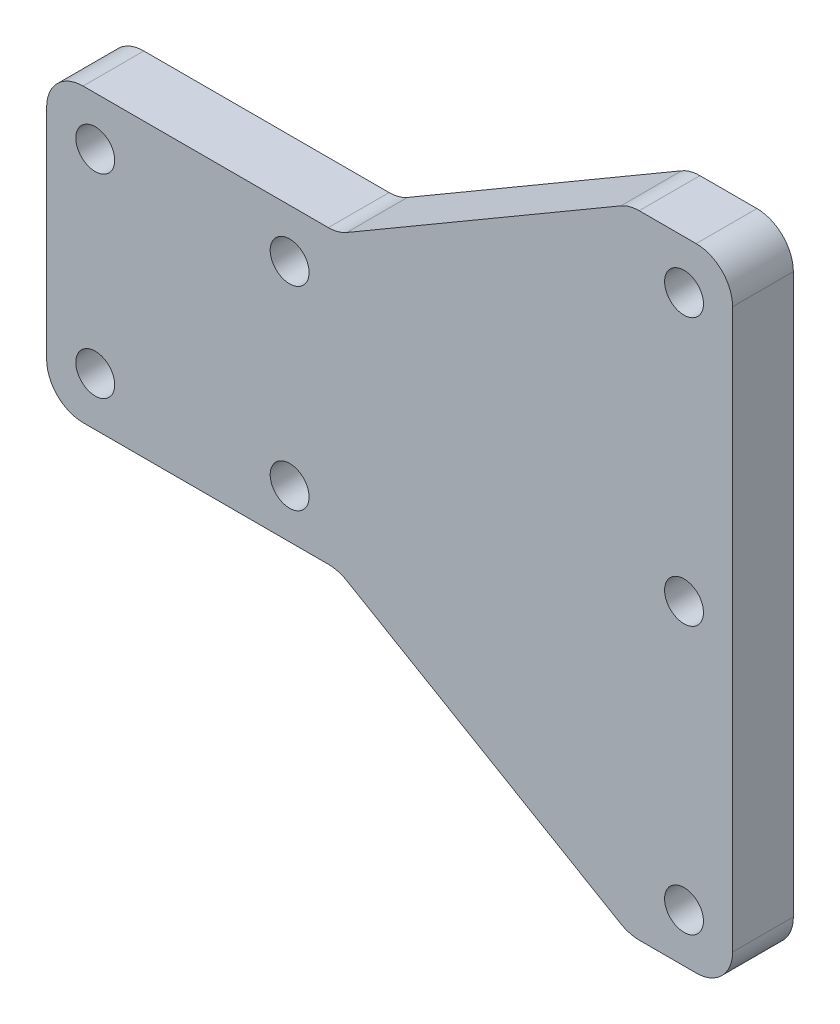
ISO-10303-21;
HEADER;
FILE_DESCRIPTION(('STEP AP214'),'2;1');
FILE_NAME('part.step','',(''),(''),'','','');
FILE_SCHEMA(('AUTOMOTIVE_DESIGN { 1 0 10303 214 1 1 1 1 }'));
ENDSEC;
DATA;
#1=APPLICATION_CONTEXT('core data for automotive mechanical design processes');
#2=APPLICATION_PROTOCOL_DEFINITION('international standard','automotive_design',2000,#1);
#3=PRODUCT_CONTEXT('',#1,'mechanical');
#4=PRODUCT('Part','Part','',(#3));
#5=PRODUCT_RELATED_PRODUCT_CATEGORY('part','',(#4));
#6=PRODUCT_DEFINITION_FORMATION('','',#4);
#7=PRODUCT_DEFINITION_CONTEXT('part definition',#1,'design');
#8=PRODUCT_DEFINITION('design','',#6,#7);
#9=PRODUCT_DEFINITION_SHAPE('','',#8);
#10=(LENGTH_UNIT() NAMED_UNIT(*) SI_UNIT(.MILLI.,.METRE.));
#11=(NAMED_UNIT(*) PLANE_ANGLE_UNIT() SI_UNIT($,.RADIAN.));
#12=(NAMED_UNIT(*) SI_UNIT($,.STERADIAN.) SOLID_ANGLE_UNIT());
#13=UNCERTAINTY_MEASURE_WITH_UNIT(LENGTH_MEASURE(1.E-05),#10,'distance_accuracy_value','');
#14=(GEOMETRIC_REPRESENTATION_CONTEXT(3) GLOBAL_UNCERTAINTY_ASSIGNED_CONTEXT((#13)) GLOBAL_UNIT_ASSIGNED_CONTEXT((#10,
#11,#12)) REPRESENTATION_CONTEXT('',''));
#15=CARTESIAN_POINT('',(0.,0.,0.));
#16=DIRECTION('',(0.,0.,1.));
#17=DIRECTION('',(1.,0.,0.));
#18=AXIS2_PLACEMENT_3D('',#15,#16,#17);
#19=CARTESIAN_POINT('',(0.,-12.,5.));
#20=DIRECTION('',(0.,1.,0.));
#21=DIRECTION('',(0.,0.,1.));
#22=AXIS2_PLACEMENT_3D('',#19,#20,#21);
#23=PLANE('',#22);
#24=DIRECTION('',(1.,0.,0.));
#25=VECTOR('',#24,1.);
#26=CARTESIAN_POINT('',(0.,-12.,0.));
#27=LINE('',#26,#25);
#28=CARTESIAN_POINT('',(-9.,-12.,0.));
#29=VERTEX_POINT('',#28);
#30=CARTESIAN_POINT('',(11.1879150973778,-12.,0.));
#31=VERTEX_POINT('',#30);
#32=EDGE_CURVE('E305',#29,#31,#27,.T.);
#33=ORIENTED_EDGE('',*,*,#32,.T.);
#34=DIRECTION('',(0.,0.,-1.));
#35=VECTOR('',#34,1.);
#36=CARTESIAN_POINT('',(11.1879150973778,-12.,5.));
#37=LINE('',#36,#35);
#38=CARTESIAN_POINT('',(11.1879150973778,-12.,5.));
#39=VERTEX_POINT('',#38);
#40=EDGE_CURVE('E293',#31,#39,#37,.F.);
#41=ORIENTED_EDGE('',*,*,#40,.T.);
#42=DIRECTION('',(1.,0.,0.));
#43=VECTOR('',#42,1.);
#44=CARTESIAN_POINT('',(0.,-12.,5.));
#45=LINE('',#44,#43);
#46=CARTESIAN_POINT('',(-9.,-12.,5.));
#47=VERTEX_POINT('',#46);
#48=EDGE_CURVE('E327',#47,#39,#45,.T.);
#49=ORIENTED_EDGE('',*,*,#48,.F.);
#50=DIRECTION('',(0.,0.,-1.));
#51=VECTOR('',#50,1.);
#52=CARTESIAN_POINT('',(-9.,-12.,5.));
#53=LINE('',#52,#51);
#54=EDGE_CURVE('E289',#47,#29,#53,.T.);
#55=ORIENTED_EDGE('',*,*,#54,.T.);
#56=EDGE_LOOP('',(#33,#41,#49,#55));
#57=FACE_BOUND('',#56,.T.);
#58=ADVANCED_FACE('F41',(#57),#23,.F.);
#59=CARTESIAN_POINT('',(-2.17323377367622,-3.72003296496675,5.));
#60=DIRECTION('',(0.504427615444684,0.863453983010554,0.));
#61=DIRECTION('',(-0.863453983010554,0.504427615444684,0.));
#62=AXIS2_PLACEMENT_3D('',#59,#60,#61);
#63=PLANE('',#62);
#64=DIRECTION('',(0.863453983010554,-0.504427615444684,0.));
#65=VECTOR('',#64,1.);
#66=CARTESIAN_POINT('',(-2.17323377367622,-3.72003296496675,0.));
#67=LINE('',#66,#65);
#68=CARTESIAN_POINT('',(12.7011979437119,-12.4096380509683,0.));
#69=VERTEX_POINT('',#68);
#70=CARTESIAN_POINT('',(35.2633023969191,-25.5903619490317,0.));
#71=VERTEX_POINT('',#70);
#72=EDGE_CURVE('E307',#69,#71,#67,.T.);
#73=ORIENTED_EDGE('',*,*,#72,.T.);
#74=DIRECTION('',(0.,0.,-1.));
#75=VECTOR('',#74,1.);
#76=CARTESIAN_POINT('',(35.263302396919,-25.5903619490317,5.));
#77=LINE('',#76,#75);
#78=CARTESIAN_POINT('',(35.2633023969191,-25.5903619490317,5.));
#79=VERTEX_POINT('',#78);
#80=EDGE_CURVE('E266',#71,#79,#77,.F.);
#81=ORIENTED_EDGE('',*,*,#80,.T.);
#82=DIRECTION('',(0.863453983010554,-0.504427615444684,0.));
#83=VECTOR('',#82,1.);
#84=CARTESIAN_POINT('',(-2.17323377367622,-3.72003296496675,5.));
#85=LINE('',#84,#83);
#86=CARTESIAN_POINT('',(12.7011979437119,-12.4096380509683,5.));
#87=VERTEX_POINT('',#86);
#88=EDGE_CURVE('E325',#87,#79,#85,.T.);
#89=ORIENTED_EDGE('',*,*,#88,.F.);
#90=DIRECTION('',(0.,0.,-1.));
#91=VECTOR('',#90,1.);
#92=CARTESIAN_POINT('',(12.7011979437119,-12.4096380509683,0.));
#93=LINE('',#92,#91);
#94=EDGE_CURVE('E262',#87,#69,#93,.T.);
#95=ORIENTED_EDGE('',*,*,#94,.T.);
#96=EDGE_LOOP('',(#73,#81,#89,#95));
#97=FACE_BOUND('',#96,.T.);
#98=ADVANCED_FACE('F329',(#97),#63,.F.);
#99=CARTESIAN_POINT('',(0.,-26.,5.));
#100=DIRECTION('',(0.,-1.,0.));
#101=DIRECTION('',(0.,0.,-1.));
#102=AXIS2_PLACEMENT_3D('',#99,#100,#101);
#103=PLANE('',#102);
#104=DIRECTION('',(-1.,0.,0.));
#105=VECTOR('',#104,1.);
#106=CARTESIAN_POINT('',(0.,-26.,0.));
#107=LINE('',#106,#105);
#108=CARTESIAN_POINT('',(41.4645003406306,-26.,0.));
#109=VERTEX_POINT('',#108);
#110=CARTESIAN_POINT('',(36.7765852432531,-26.,0.));
#111=VERTEX_POINT('',#110);
#112=EDGE_CURVE('E195',#109,#111,#107,.T.);
#113=ORIENTED_EDGE('',*,*,#112,.F.);
#114=DIRECTION('',(0.,0.,-1.));
#115=VECTOR('',#114,1.);
#116=CARTESIAN_POINT('',(41.4645003406306,-26.,5.));
#117=LINE('',#116,#115);
#118=CARTESIAN_POINT('',(41.4645003406306,-26.,5.));
#119=VERTEX_POINT('',#118);
#120=EDGE_CURVE('E259',#109,#119,#117,.F.);
#121=ORIENTED_EDGE('',*,*,#120,.T.);
#122=DIRECTION('',(-1.,0.,0.));
#123=VECTOR('',#122,1.);
#124=CARTESIAN_POINT('',(0.,-26.,5.));
#125=LINE('',#124,#123);
#126=CARTESIAN_POINT('',(36.7765852432531,-26.,5.));
#127=VERTEX_POINT('',#126);
#128=EDGE_CURVE('E332',#119,#127,#125,.T.);
#129=ORIENTED_EDGE('',*,*,#128,.T.);
#130=DIRECTION('',(0.,0.,-1.));
#131=VECTOR('',#130,1.);
#132=CARTESIAN_POINT('',(36.7765852432531,-26.,0.));
#133=LINE('',#132,#131);
#134=EDGE_CURVE('E255',#127,#111,#133,.T.);
#135=ORIENTED_EDGE('',*,*,#134,.T.);
#136=EDGE_LOOP('',(#113,#121,#129,#135));
#137=FACE_BOUND('',#136,.T.);
#138=ADVANCED_FACE('F390',(#137),#103,.T.);
#139=CARTESIAN_POINT('',(44.4645003406306,0.,5.));
#140=DIRECTION('',(1.,0.,0.));
#141=DIRECTION('',(0.,0.,-1.));
#142=AXIS2_PLACEMENT_3D('',#139,#140,#141);
#143=PLANE('',#142);
#144=DIRECTION('',(0.,-1.,0.));
#145=VECTOR('',#144,1.);
#146=CARTESIAN_POINT('',(44.4645003406306,0.,0.));
#147=LINE('',#146,#145);
#148=CARTESIAN_POINT('',(44.4645003406306,23.,0.));
#149=VERTEX_POINT('',#148);
#150=CARTESIAN_POINT('',(44.4645003406306,-23.,0.));
#151=VERTEX_POINT('',#150);
#152=EDGE_CURVE('E188',#149,#151,#147,.T.);
#153=ORIENTED_EDGE('',*,*,#152,.F.);
#154=DIRECTION('',(0.,0.,-1.));
#155=VECTOR('',#154,1.);
#156=CARTESIAN_POINT('',(44.4645003406306,23.,5.));
#157=LINE('',#156,#155);
#158=CARTESIAN_POINT('',(44.4645003406306,23.,5.));
#159=VERTEX_POINT('',#158);
#160=EDGE_CURVE('E161',#149,#159,#157,.F.);
#161=ORIENTED_EDGE('',*,*,#160,.T.);
#162=DIRECTION('',(0.,-1.,0.));
#163=VECTOR('',#162,1.);
#164=CARTESIAN_POINT('',(44.4645003406306,0.,5.));
#165=LINE('',#164,#163);
#166=CARTESIAN_POINT('',(44.4645003406306,-23.,5.));
#167=VERTEX_POINT('',#166);
#168=EDGE_CURVE('E337',#159,#167,#165,.T.);
#169=ORIENTED_EDGE('',*,*,#168,.T.);
#170=DIRECTION('',(0.,0.,-1.));
#171=VECTOR('',#170,1.);
#172=CARTESIAN_POINT('',(44.4645003406306,-23.,5.));
#173=LINE('',#172,#171);
#174=EDGE_CURVE('E167',#167,#151,#173,.T.);
#175=ORIENTED_EDGE('',*,*,#174,.T.);
#176=EDGE_LOOP('',(#153,#161,#169,#175));
#177=FACE_BOUND('',#176,.T.);
#178=ADVANCED_FACE('F398',(#177),#143,.T.);
#179=CARTESIAN_POINT('',(0.,26.,5.));
#180=DIRECTION('',(0.,-1.,0.));
#181=DIRECTION('',(0.,0.,-1.));
#182=AXIS2_PLACEMENT_3D('',#179,#180,#181);
#183=PLANE('',#182);
#184=DIRECTION('',(-1.,0.,0.));
#185=VECTOR('',#184,1.);
#186=CARTESIAN_POINT('',(0.,26.,5.));
#187=LINE('',#186,#185);
#188=CARTESIAN_POINT('',(41.4645003406306,26.,5.));
#189=VERTEX_POINT('',#188);
#190=CARTESIAN_POINT('',(36.7765852432531,26.,5.));
#191=VERTEX_POINT('',#190);
#192=EDGE_CURVE('E177',#189,#191,#187,.T.);
#193=ORIENTED_EDGE('',*,*,#192,.F.);
#194=DIRECTION('',(0.,0.,-1.));
#195=VECTOR('',#194,1.);
#196=CARTESIAN_POINT('',(41.4645003406306,26.,0.));
#197=LINE('',#196,#195);
#198=CARTESIAN_POINT('',(41.4645003406306,26.,0.));
#199=VERTEX_POINT('',#198);
#200=EDGE_CURVE('E160',#189,#199,#197,.T.);
#201=ORIENTED_EDGE('',*,*,#200,.T.);
#202=DIRECTION('',(-1.,0.,0.));
#203=VECTOR('',#202,1.);
#204=CARTESIAN_POINT('',(0.,26.,0.));
#205=LINE('',#204,#203);
#206=CARTESIAN_POINT('',(36.7765852432531,26.,0.));
#207=VERTEX_POINT('',#206);
#208=EDGE_CURVE('E174',#199,#207,#205,.T.);
#209=ORIENTED_EDGE('',*,*,#208,.T.);
#210=DIRECTION('',(0.,0.,-1.));
#211=VECTOR('',#210,1.);
#212=CARTESIAN_POINT('',(36.7765852432531,26.,5.));
#213=LINE('',#212,#211);
#214=EDGE_CURVE('E180',#207,#191,#213,.F.);
#215=ORIENTED_EDGE('',*,*,#214,.T.);
#216=EDGE_LOOP('',(#193,#201,#209,#215));
#217=FACE_BOUND('',#216,.T.);
#218=ADVANCED_FACE('F173',(#217),#183,.F.);
#219=CARTESIAN_POINT('',(-2.17323377367623,3.72003296496676,5.));
#220=DIRECTION('',(0.504427615444683,-0.863453983010554,0.));
#221=DIRECTION('',(0.863453983010554,0.504427615444683,0.));
#222=AXIS2_PLACEMENT_3D('',#219,#220,#221);
#223=PLANE('',#222);
#224=DIRECTION('',(-0.863453983010554,-0.504427615444683,0.));
#225=VECTOR('',#224,1.);
#226=CARTESIAN_POINT('',(-2.17323377367623,3.72003296496676,5.));
#227=LINE('',#226,#225);
#228=CARTESIAN_POINT('',(35.2633023969191,25.5903619490317,5.));
#229=VERTEX_POINT('',#228);
#230=CARTESIAN_POINT('',(12.7011979437119,12.4096380509683,5.));
#231=VERTEX_POINT('',#230);
#232=EDGE_CURVE('E348',#229,#231,#227,.T.);
#233=ORIENTED_EDGE('',*,*,#232,.F.);
#234=DIRECTION('',(0.,0.,-1.));
#235=VECTOR('',#234,1.);
#236=CARTESIAN_POINT('',(35.2633023969191,25.5903619490317,5.));
#237=LINE('',#236,#235);
#238=CARTESIAN_POINT('',(35.2633023969191,25.5903619490317,0.));
#239=VERTEX_POINT('',#238);
#240=EDGE_CURVE('E272',#229,#239,#237,.T.);
#241=ORIENTED_EDGE('',*,*,#240,.T.);
#242=DIRECTION('',(-0.863453983010554,-0.504427615444683,0.));
#243=VECTOR('',#242,1.);
#244=CARTESIAN_POINT('',(-2.17323377367623,3.72003296496676,0.));
#245=LINE('',#244,#243);
#246=CARTESIAN_POINT('',(12.7011979437119,12.4096380509683,0.));
#247=VERTEX_POINT('',#246);
#248=EDGE_CURVE('E187',#239,#247,#245,.T.);
#249=ORIENTED_EDGE('',*,*,#248,.T.);
#250=DIRECTION('',(0.,0.,-1.));
#251=VECTOR('',#250,1.);
#252=CARTESIAN_POINT('',(12.7011979437119,12.4096380509683,5.));
#253=LINE('',#252,#251);
#254=EDGE_CURVE('E269',#247,#231,#253,.F.);
#255=ORIENTED_EDGE('',*,*,#254,.T.);
#256=EDGE_LOOP('',(#233,#241,#249,#255));
#257=FACE_BOUND('',#256,.T.);
#258=ADVANCED_FACE('F405',(#257),#223,.F.);
#259=CARTESIAN_POINT('',(0.,12.,5.));
#260=DIRECTION('',(0.,-1.,0.));
#261=DIRECTION('',(1.,0.,0.));
#262=AXIS2_PLACEMENT_3D('',#259,#260,#261);
#263=PLANE('',#262);
#264=DIRECTION('',(-1.,0.,0.));
#265=VECTOR('',#264,1.);
#266=CARTESIAN_POINT('',(0.,12.,5.));
#267=LINE('',#266,#265);
#268=CARTESIAN_POINT('',(11.1879150973778,12.,5.));
#269=VERTEX_POINT('',#268);
#270=CARTESIAN_POINT('',(-9.,12.,5.));
#271=VERTEX_POINT('',#270);
#272=EDGE_CURVE('E352',#269,#271,#267,.T.);
#273=ORIENTED_EDGE('',*,*,#272,.F.);
#274=DIRECTION('',(0.,0.,-1.));
#275=VECTOR('',#274,1.);
#276=CARTESIAN_POINT('',(11.1879150973778,12.,0.));
#277=LINE('',#276,#275);
#278=CARTESIAN_POINT('',(11.1879150973778,12.,0.));
#279=VERTEX_POINT('',#278);
#280=EDGE_CURVE('E279',#269,#279,#277,.T.);
#281=ORIENTED_EDGE('',*,*,#280,.T.);
#282=DIRECTION('',(-1.,0.,0.));
#283=VECTOR('',#282,1.);
#284=CARTESIAN_POINT('',(0.,12.,0.));
#285=LINE('',#284,#283);
#286=CARTESIAN_POINT('',(-9.,12.,0.));
#287=VERTEX_POINT('',#286);
#288=EDGE_CURVE('E193',#279,#287,#285,.T.);
#289=ORIENTED_EDGE('',*,*,#288,.T.);
#290=DIRECTION('',(0.,0.,-1.));
#291=VECTOR('',#290,1.);
#292=CARTESIAN_POINT('',(-9.,12.,5.));
#293=LINE('',#292,#291);
#294=EDGE_CURVE('E276',#287,#271,#293,.F.);
#295=ORIENTED_EDGE('',*,*,#294,.T.);
#296=EDGE_LOOP('',(#273,#281,#289,#295));
#297=FACE_BOUND('',#296,.T.);
#298=ADVANCED_FACE('F466',(#297),#263,.F.);
#299=CARTESIAN_POINT('',(40.4645003406309,-22.,5.));
#300=DIRECTION('',(0.,0.,-1.));
#301=DIRECTION('',(-1.,0.,0.));
#302=AXIS2_PLACEMENT_3D('',#299,#300,#301);
#303=CYLINDRICAL_SURFACE('',#302,1.6);
#304=CARTESIAN_POINT('',(40.4645003406309,-22.,5.));
#305=DIRECTION('',(0.,0.,1.));
#306=DIRECTION('',(1.,0.,0.));
#307=AXIS2_PLACEMENT_3D('',#304,#305,#306);
#308=CIRCLE('',#307,1.6);
#309=CARTESIAN_POINT('',(42.0645003406309,-22.,5.));
#310=VERTEX_POINT('',#309);
#311=EDGE_CURVE('E362',#310,#310,#308,.T.);
#312=ORIENTED_EDGE('',*,*,#311,.T.);
#313=EDGE_LOOP('',(#312));
#314=FACE_BOUND('',#313,.T.);
#315=CARTESIAN_POINT('',(40.4645003406309,-22.,0.));
#316=DIRECTION('',(0.,0.,1.));
#317=DIRECTION('',(1.,0.,0.));
#318=AXIS2_PLACEMENT_3D('',#315,#316,#317);
#319=CIRCLE('',#318,1.6);
#320=CARTESIAN_POINT('',(42.0645003406309,-22.,0.));
#321=VERTEX_POINT('',#320);
#322=EDGE_CURVE('E209',#321,#321,#319,.T.);
#323=ORIENTED_EDGE('',*,*,#322,.F.);
#324=EDGE_LOOP('',(#323));
#325=FACE_BOUND('',#324,.T.);
#326=ADVANCED_FACE('F479',(#314,#325),#303,.F.);
#327=CARTESIAN_POINT('',(40.4645003406307,0.,5.));
#328=DIRECTION('',(0.,0.,-1.));
#329=DIRECTION('',(-1.,0.,0.));
#330=AXIS2_PLACEMENT_3D('',#327,#328,#329);
#331=CYLINDRICAL_SURFACE('',#330,1.6);
#332=CARTESIAN_POINT('',(40.4645003406307,0.,5.));
#333=DIRECTION('',(0.,0.,1.));
#334=DIRECTION('',(1.,0.,0.));
#335=AXIS2_PLACEMENT_3D('',#332,#333,#334);
#336=CIRCLE('',#335,1.6);
#337=CARTESIAN_POINT('',(42.0645003406306,0.,5.));
#338=VERTEX_POINT('',#337);
#339=EDGE_CURVE('E358',#338,#338,#336,.T.);
#340=ORIENTED_EDGE('',*,*,#339,.T.);
#341=EDGE_LOOP('',(#340));
#342=FACE_BOUND('',#341,.T.);
#343=CARTESIAN_POINT('',(40.4645003406307,0.,0.));
#344=DIRECTION('',(0.,0.,1.));
#345=DIRECTION('',(1.,0.,0.));
#346=AXIS2_PLACEMENT_3D('',#343,#344,#345);
#347=CIRCLE('',#346,1.6);
#348=CARTESIAN_POINT('',(42.0645003406306,0.,0.));
#349=VERTEX_POINT('',#348);
#350=EDGE_CURVE('E205',#349,#349,#347,.T.);
#351=ORIENTED_EDGE('',*,*,#350,.F.);
#352=EDGE_LOOP('',(#351));
#353=FACE_BOUND('',#352,.T.);
#354=ADVANCED_FACE('F484',(#342,#353),#331,.F.);
#355=CARTESIAN_POINT('',(-12.,0.,5.));
#356=DIRECTION('',(1.,0.,0.));
#357=DIRECTION('',(0.,1.,0.));
#358=AXIS2_PLACEMENT_3D('',#355,#356,#357);
#359=PLANE('',#358);
#360=DIRECTION('',(0.,-1.,0.));
#361=VECTOR('',#360,1.);
#362=CARTESIAN_POINT('',(-12.,0.,5.));
#363=LINE('',#362,#361);
#364=CARTESIAN_POINT('',(-12.,9.,5.));
#365=VERTEX_POINT('',#364);
#366=CARTESIAN_POINT('',(-12.,-9.,5.));
#367=VERTEX_POINT('',#366);
#368=EDGE_CURVE('E355',#365,#367,#363,.T.);
#369=ORIENTED_EDGE('',*,*,#368,.F.);
#370=DIRECTION('',(0.,0.,-1.));
#371=VECTOR('',#370,1.);
#372=CARTESIAN_POINT('',(-12.,9.,5.));
#373=LINE('',#372,#371);
#374=CARTESIAN_POINT('',(-12.,9.,0.));
#375=VERTEX_POINT('',#374);
#376=EDGE_CURVE('E285',#365,#375,#373,.T.);
#377=ORIENTED_EDGE('',*,*,#376,.T.);
#378=DIRECTION('',(0.,-1.,0.));
#379=VECTOR('',#378,1.);
#380=CARTESIAN_POINT('',(-12.,0.,0.));
#381=LINE('',#380,#379);
#382=CARTESIAN_POINT('',(-12.,-9.,0.));
#383=VERTEX_POINT('',#382);
#384=EDGE_CURVE('E202',#375,#383,#381,.T.);
#385=ORIENTED_EDGE('',*,*,#384,.T.);
#386=DIRECTION('',(0.,0.,-1.));
#387=VECTOR('',#386,1.);
#388=CARTESIAN_POINT('',(-12.,-9.,5.));
#389=LINE('',#388,#387);
#390=EDGE_CURVE('E57',#383,#367,#389,.F.);
#391=ORIENTED_EDGE('',*,*,#390,.T.);
#392=EDGE_LOOP('',(#369,#377,#385,#391));
#393=FACE_BOUND('',#392,.T.);
#394=ADVANCED_FACE('F419',(#393),#359,.F.);
#395=CARTESIAN_POINT('',(-8.,-8.,5.));
#396=DIRECTION('',(0.,0.,-1.));
#397=DIRECTION('',(-1.,0.,0.));
#398=AXIS2_PLACEMENT_3D('',#395,#396,#397);
#399=CYLINDRICAL_SURFACE('',#398,1.6);
#400=CARTESIAN_POINT('',(-8.,-8.,5.));
#401=DIRECTION('',(0.,0.,1.));
#402=DIRECTION('',(1.,0.,0.));
#403=AXIS2_PLACEMENT_3D('',#400,#401,#402);
#404=CIRCLE('',#403,1.6);
#405=CARTESIAN_POINT('',(-6.4,-8.,5.));
#406=VERTEX_POINT('',#405);
#407=EDGE_CURVE('E339',#406,#406,#404,.T.);
#408=ORIENTED_EDGE('',*,*,#407,.T.);
#409=EDGE_LOOP('',(#408));
#410=FACE_BOUND('',#409,.T.);
#411=CARTESIAN_POINT('',(-8.,-8.,0.));
#412=DIRECTION('',(0.,0.,1.));
#413=DIRECTION('',(1.,0.,0.));
#414=AXIS2_PLACEMENT_3D('',#411,#412,#413);
#415=CIRCLE('',#414,1.6);
#416=CARTESIAN_POINT('',(-6.4,-8.,0.));
#417=VERTEX_POINT('',#416);
#418=EDGE_CURVE('E316',#417,#417,#415,.T.);
#419=ORIENTED_EDGE('',*,*,#418,.F.);
#420=EDGE_LOOP('',(#419));
#421=FACE_BOUND('',#420,.T.);
#422=ADVANCED_FACE('F415',(#410,#421),#399,.F.);
#423=CARTESIAN_POINT('',(8.,-8.,5.));
#424=DIRECTION('',(0.,0.,-1.));
#425=DIRECTION('',(-1.,0.,0.));
#426=AXIS2_PLACEMENT_3D('',#423,#424,#425);
#427=CYLINDRICAL_SURFACE('',#426,1.6);
#428=CARTESIAN_POINT('',(8.,-8.,5.));
#429=DIRECTION('',(0.,0.,1.));
#430=DIRECTION('',(1.,0.,0.));
#431=AXIS2_PLACEMENT_3D('',#428,#429,#430);
#432=CIRCLE('',#431,1.6);
#433=CARTESIAN_POINT('',(9.6,-8.,5.));
#434=VERTEX_POINT('',#433);
#435=EDGE_CURVE('E511',#434,#434,#432,.T.);
#436=ORIENTED_EDGE('',*,*,#435,.T.);
#437=EDGE_LOOP('',(#436));
#438=FACE_BOUND('',#437,.T.);
#439=CARTESIAN_POINT('',(8.,-8.,0.));
#440=DIRECTION('',(0.,0.,1.));
#441=DIRECTION('',(1.,0.,0.));
#442=AXIS2_PLACEMENT_3D('',#439,#440,#441);
#443=CIRCLE('',#442,1.6);
#444=CARTESIAN_POINT('',(9.6,-8.,0.));
#445=VERTEX_POINT('',#444);
#446=EDGE_CURVE('E377',#445,#445,#443,.T.);
#447=ORIENTED_EDGE('',*,*,#446,.F.);
#448=EDGE_LOOP('',(#447));
#449=FACE_BOUND('',#448,.T.);
#450=ADVANCED_FACE('F418',(#438,#449),#427,.F.);
#451=CARTESIAN_POINT('',(-8.,8.,5.));
#452=DIRECTION('',(0.,0.,-1.));
#453=DIRECTION('',(-1.,0.,0.));
#454=AXIS2_PLACEMENT_3D('',#451,#452,#453);
#455=CYLINDRICAL_SURFACE('',#454,1.6);
#456=CARTESIAN_POINT('',(-8.,8.,5.));
#457=DIRECTION('',(0.,0.,1.));
#458=DIRECTION('',(1.,0.,0.));
#459=AXIS2_PLACEMENT_3D('',#456,#457,#458);
#460=CIRCLE('',#459,1.6);
#461=CARTESIAN_POINT('',(-6.4,8.,5.));
#462=VERTEX_POINT('',#461);
#463=EDGE_CURVE('E507',#462,#462,#460,.T.);
#464=ORIENTED_EDGE('',*,*,#463,.T.);
#465=EDGE_LOOP('',(#464));
#466=FACE_BOUND('',#465,.T.);
#467=CARTESIAN_POINT('',(-8.,8.,0.));
#468=DIRECTION('',(0.,0.,1.));
#469=DIRECTION('',(1.,0.,0.));
#470=AXIS2_PLACEMENT_3D('',#467,#468,#469);
#471=CIRCLE('',#470,1.6);
#472=CARTESIAN_POINT('',(-6.4,8.,0.));
#473=VERTEX_POINT('',#472);
#474=EDGE_CURVE('E373',#473,#473,#471,.T.);
#475=ORIENTED_EDGE('',*,*,#474,.F.);
#476=EDGE_LOOP('',(#475));
#477=FACE_BOUND('',#476,.T.);
#478=ADVANCED_FACE('F423',(#466,#477),#455,.F.);
#479=CARTESIAN_POINT('',(8.,8.,5.));
#480=DIRECTION('',(0.,0.,-1.));
#481=DIRECTION('',(-1.,0.,0.));
#482=AXIS2_PLACEMENT_3D('',#479,#480,#481);
#483=CYLINDRICAL_SURFACE('',#482,1.6);
#484=CARTESIAN_POINT('',(8.,8.,5.));
#485=DIRECTION('',(0.,0.,1.));
#486=DIRECTION('',(1.,0.,0.));
#487=AXIS2_PLACEMENT_3D('',#484,#485,#486);
#488=CIRCLE('',#487,1.6);
#489=CARTESIAN_POINT('',(9.6,8.,5.));
#490=VERTEX_POINT('',#489);
#491=EDGE_CURVE('E217',#490,#490,#488,.T.);
#492=ORIENTED_EDGE('',*,*,#491,.T.);
#493=EDGE_LOOP('',(#492));
#494=FACE_BOUND('',#493,.T.);
#495=CARTESIAN_POINT('',(8.,8.,0.));
#496=DIRECTION('',(0.,0.,1.));
#497=DIRECTION('',(1.,0.,0.));
#498=AXIS2_PLACEMENT_3D('',#495,#496,#497);
#499=CIRCLE('',#498,1.6);
#500=CARTESIAN_POINT('',(9.6,8.,0.));
#501=VERTEX_POINT('',#500);
#502=EDGE_CURVE('E369',#501,#501,#499,.T.);
#503=ORIENTED_EDGE('',*,*,#502,.F.);
#504=EDGE_LOOP('',(#503));
#505=FACE_BOUND('',#504,.T.);
#506=ADVANCED_FACE('F427',(#494,#505),#483,.F.);
#507=CARTESIAN_POINT('',(40.4645003406309,22.,5.));
#508=DIRECTION('',(0.,0.,-1.));
#509=DIRECTION('',(-1.,0.,0.));
#510=AXIS2_PLACEMENT_3D('',#507,#508,#509);
#511=CYLINDRICAL_SURFACE('',#510,1.6);
#512=CARTESIAN_POINT('',(40.4645003406309,22.,5.));
#513=DIRECTION('',(0.,0.,1.));
#514=DIRECTION('',(1.,0.,0.));
#515=AXIS2_PLACEMENT_3D('',#512,#513,#514);
#516=CIRCLE('',#515,1.6);
#517=CARTESIAN_POINT('',(42.0645003406309,22.,5.));
#518=VERTEX_POINT('',#517);
#519=EDGE_CURVE('E219',#518,#518,#516,.F.);
#520=ORIENTED_EDGE('',*,*,#519,.F.);
#521=EDGE_LOOP('',(#520));
#522=FACE_BOUND('',#521,.T.);
#523=CARTESIAN_POINT('',(40.4645003406309,22.,0.));
#524=DIRECTION('',(0.,0.,1.));
#525=DIRECTION('',(1.,0.,0.));
#526=AXIS2_PLACEMENT_3D('',#523,#524,#525);
#527=CIRCLE('',#526,1.6);
#528=CARTESIAN_POINT('',(42.0645003406309,22.,0.));
#529=VERTEX_POINT('',#528);
#530=EDGE_CURVE('E213',#529,#529,#527,.F.);
#531=ORIENTED_EDGE('',*,*,#530,.T.);
#532=EDGE_LOOP('',(#531));
#533=FACE_BOUND('',#532,.T.);
#534=ADVANCED_FACE('F431',(#522,#533),#511,.F.);
#535=CARTESIAN_POINT('',(0.,0.,5.));
#536=DIRECTION('',(0.,0.,1.));
#537=DIRECTION('',(1.,0.,0.));
#538=AXIS2_PLACEMENT_3D('',#535,#536,#537);
#539=PLANE('',#538);
#540=ORIENTED_EDGE('',*,*,#491,.F.);
#541=EDGE_LOOP('',(#540));
#542=FACE_BOUND('',#541,.T.);
#543=ORIENTED_EDGE('',*,*,#463,.F.);
#544=EDGE_LOOP('',(#543));
#545=FACE_BOUND('',#544,.T.);
#546=ORIENTED_EDGE('',*,*,#435,.F.);
#547=EDGE_LOOP('',(#546));
#548=FACE_BOUND('',#547,.T.);
#549=ORIENTED_EDGE('',*,*,#407,.F.);
#550=EDGE_LOOP('',(#549));
#551=FACE_BOUND('',#550,.T.);
#552=ORIENTED_EDGE('',*,*,#168,.F.);
#553=CARTESIAN_POINT('',(41.4645003406306,23.,5.));
#554=DIRECTION('',(0.,0.,1.));
#555=DIRECTION('',(1.,0.,0.));
#556=AXIS2_PLACEMENT_3D('',#553,#554,#555);
#557=CIRCLE('',#556,3.);
#558=EDGE_CURVE('E252',#159,#189,#557,.T.);
#559=ORIENTED_EDGE('',*,*,#558,.T.);
#560=ORIENTED_EDGE('',*,*,#192,.T.);
#561=CARTESIAN_POINT('',(36.7765852432531,23.,5.));
#562=DIRECTION('',(0.,0.,1.));
#563=DIRECTION('',(1.,0.,0.));
#564=AXIS2_PLACEMENT_3D('',#561,#562,#563);
#565=CIRCLE('',#564,3.);
#566=EDGE_CURVE('E243',#191,#229,#565,.T.);
#567=ORIENTED_EDGE('',*,*,#566,.T.);
#568=ORIENTED_EDGE('',*,*,#232,.T.);
#569=CARTESIAN_POINT('',(11.1879150973778,15.,5.));
#570=DIRECTION('',(0.,0.,1.));
#571=DIRECTION('',(1.,0.,0.));
#572=AXIS2_PLACEMENT_3D('',#569,#570,#571);
#573=CIRCLE('',#572,3.);
#574=EDGE_CURVE('E299',#231,#269,#573,.F.);
#575=ORIENTED_EDGE('',*,*,#574,.T.);
#576=ORIENTED_EDGE('',*,*,#272,.T.);
#577=CARTESIAN_POINT('',(-9.,9.,5.));
#578=DIRECTION('',(0.,0.,1.));
#579=DIRECTION('',(1.,0.,0.));
#580=AXIS2_PLACEMENT_3D('',#577,#578,#579);
#581=CIRCLE('',#580,3.);
#582=EDGE_CURVE('E64',#271,#365,#581,.T.);
#583=ORIENTED_EDGE('',*,*,#582,.T.);
#584=ORIENTED_EDGE('',*,*,#368,.T.);
#585=CARTESIAN_POINT('',(-9.,-9.,5.));
#586=DIRECTION('',(0.,0.,1.));
#587=DIRECTION('',(1.,0.,0.));
#588=AXIS2_PLACEMENT_3D('',#585,#586,#587);
#589=CIRCLE('',#588,3.);
#590=EDGE_CURVE('E238',#367,#47,#589,.T.);
#591=ORIENTED_EDGE('',*,*,#590,.T.);
#592=ORIENTED_EDGE('',*,*,#48,.T.);
#593=CARTESIAN_POINT('',(11.1879150973778,-15.,5.));
#594=DIRECTION('',(0.,0.,1.));
#595=DIRECTION('',(1.,0.,0.));
#596=AXIS2_PLACEMENT_3D('',#593,#594,#595);
#597=CIRCLE('',#596,3.);
#598=EDGE_CURVE('E11',#39,#87,#597,.F.);
#599=ORIENTED_EDGE('',*,*,#598,.T.);
#600=ORIENTED_EDGE('',*,*,#88,.T.);
#601=CARTESIAN_POINT('',(36.7765852432531,-23.,5.));
#602=DIRECTION('',(0.,0.,1.));
#603=DIRECTION('',(1.,0.,0.));
#604=AXIS2_PLACEMENT_3D('',#601,#602,#603);
#605=CIRCLE('',#604,3.);
#606=EDGE_CURVE('E246',#79,#127,#605,.T.);
#607=ORIENTED_EDGE('',*,*,#606,.T.);
#608=ORIENTED_EDGE('',*,*,#128,.F.);
#609=CARTESIAN_POINT('',(41.4645003406306,-23.,5.));
#610=DIRECTION('',(0.,0.,1.));
#611=DIRECTION('',(1.,0.,0.));
#612=AXIS2_PLACEMENT_3D('',#609,#610,#611);
#613=CIRCLE('',#612,3.);
#614=EDGE_CURVE('E249',#119,#167,#613,.T.);
#615=ORIENTED_EDGE('',*,*,#614,.T.);
#616=EDGE_LOOP('',(#552,#559,#560,#567,#568,#575,#576,#583,#584,#591,#592,#599,#600,#607,#608,#615));
#617=FACE_BOUND('',#616,.T.);
#618=ORIENTED_EDGE('',*,*,#339,.F.);
#619=EDGE_LOOP('',(#618));
#620=FACE_BOUND('',#619,.T.);
#621=ORIENTED_EDGE('',*,*,#311,.F.);
#622=EDGE_LOOP('',(#621));
#623=FACE_BOUND('',#622,.T.);
#624=ORIENTED_EDGE('',*,*,#519,.T.);
#625=EDGE_LOOP('',(#624));
#626=FACE_BOUND('',#625,.T.);
#627=ADVANCED_FACE('F323',(#542,#545,#548,#551,#617,#620,#623,#626),#539,.T.);
#628=CARTESIAN_POINT('',(0.,0.,0.));
#629=DIRECTION('',(0.,0.,1.));
#630=DIRECTION('',(1.,0.,0.));
#631=AXIS2_PLACEMENT_3D('',#628,#629,#630);
#632=PLANE('',#631);
#633=ORIENTED_EDGE('',*,*,#502,.T.);
#634=EDGE_LOOP('',(#633));
#635=FACE_BOUND('',#634,.T.);
#636=ORIENTED_EDGE('',*,*,#474,.T.);
#637=EDGE_LOOP('',(#636));
#638=FACE_BOUND('',#637,.T.);
#639=ORIENTED_EDGE('',*,*,#446,.T.);
#640=EDGE_LOOP('',(#639));
#641=FACE_BOUND('',#640,.T.);
#642=ORIENTED_EDGE('',*,*,#418,.T.);
#643=EDGE_LOOP('',(#642));
#644=FACE_BOUND('',#643,.T.);
#645=ORIENTED_EDGE('',*,*,#208,.F.);
#646=CARTESIAN_POINT('',(41.4645003406306,23.,0.));
#647=DIRECTION('',(0.,0.,1.));
#648=DIRECTION('',(1.,0.,0.));
#649=AXIS2_PLACEMENT_3D('',#646,#647,#648);
#650=CIRCLE('',#649,3.);
#651=EDGE_CURVE('E156',#199,#149,#650,.F.);
#652=ORIENTED_EDGE('',*,*,#651,.T.);
#653=ORIENTED_EDGE('',*,*,#152,.T.);
#654=CARTESIAN_POINT('',(41.4645003406306,-23.,0.));
#655=DIRECTION('',(0.,0.,1.));
#656=DIRECTION('',(1.,0.,0.));
#657=AXIS2_PLACEMENT_3D('',#654,#655,#656);
#658=CIRCLE('',#657,3.);
#659=EDGE_CURVE('E168',#151,#109,#658,.F.);
#660=ORIENTED_EDGE('',*,*,#659,.T.);
#661=ORIENTED_EDGE('',*,*,#112,.T.);
#662=CARTESIAN_POINT('',(36.7765852432531,-23.,0.));
#663=DIRECTION('',(0.,0.,1.));
#664=DIRECTION('',(1.,0.,0.));
#665=AXIS2_PLACEMENT_3D('',#662,#663,#664);
#666=CIRCLE('',#665,3.);
#667=EDGE_CURVE('E228',#111,#71,#666,.F.);
#668=ORIENTED_EDGE('',*,*,#667,.T.);
#669=ORIENTED_EDGE('',*,*,#72,.F.);
#670=CARTESIAN_POINT('',(11.1879150973778,-15.,0.));
#671=DIRECTION('',(0.,0.,1.));
#672=DIRECTION('',(1.,0.,0.));
#673=AXIS2_PLACEMENT_3D('',#670,#671,#672);
#674=CIRCLE('',#673,3.);
#675=EDGE_CURVE('E50',#69,#31,#674,.T.);
#676=ORIENTED_EDGE('',*,*,#675,.T.);
#677=ORIENTED_EDGE('',*,*,#32,.F.);
#678=CARTESIAN_POINT('',(-9.,-9.,0.));
#679=DIRECTION('',(0.,0.,1.));
#680=DIRECTION('',(1.,0.,0.));
#681=AXIS2_PLACEMENT_3D('',#678,#679,#680);
#682=CIRCLE('',#681,3.);
#683=EDGE_CURVE('E179',#29,#383,#682,.F.);
#684=ORIENTED_EDGE('',*,*,#683,.T.);
#685=ORIENTED_EDGE('',*,*,#384,.F.);
#686=CARTESIAN_POINT('',(-9.,9.,0.));
#687=DIRECTION('',(0.,0.,1.));
#688=DIRECTION('',(1.,0.,0.));
#689=AXIS2_PLACEMENT_3D('',#686,#687,#688);
#690=CIRCLE('',#689,3.);
#691=EDGE_CURVE('E223',#375,#287,#690,.F.);
#692=ORIENTED_EDGE('',*,*,#691,.T.);
#693=ORIENTED_EDGE('',*,*,#288,.F.);
#694=CARTESIAN_POINT('',(11.1879150973778,15.,0.));
#695=DIRECTION('',(0.,0.,1.));
#696=DIRECTION('',(1.,0.,0.));
#697=AXIS2_PLACEMENT_3D('',#694,#695,#696);
#698=CIRCLE('',#697,3.);
#699=EDGE_CURVE('E296',#279,#247,#698,.T.);
#700=ORIENTED_EDGE('',*,*,#699,.T.);
#701=ORIENTED_EDGE('',*,*,#248,.F.);
#702=CARTESIAN_POINT('',(36.7765852432531,23.,0.));
#703=DIRECTION('',(0.,0.,1.));
#704=DIRECTION('',(1.,0.,0.));
#705=AXIS2_PLACEMENT_3D('',#702,#703,#704);
#706=CIRCLE('',#705,3.);
#707=EDGE_CURVE('E185',#239,#207,#706,.F.);
#708=ORIENTED_EDGE('',*,*,#707,.T.);
#709=EDGE_LOOP('',(#645,#652,#653,#660,#661,#668,#669,#676,#677,#684,#685,#692,#693,#700,#701,#708));
#710=FACE_BOUND('',#709,.T.);
#711=ORIENTED_EDGE('',*,*,#350,.T.);
#712=EDGE_LOOP('',(#711));
#713=FACE_BOUND('',#712,.T.);
#714=ORIENTED_EDGE('',*,*,#322,.T.);
#715=EDGE_LOOP('',(#714));
#716=FACE_BOUND('',#715,.T.);
#717=ORIENTED_EDGE('',*,*,#530,.F.);
#718=EDGE_LOOP('',(#717));
#719=FACE_BOUND('',#718,.T.);
#720=ADVANCED_FACE('F182',(#635,#638,#641,#644,#710,#713,#716,#719),#632,.F.);
#721=CARTESIAN_POINT('',(41.4645003406306,23.,5.));
#722=DIRECTION('',(0.,0.,1.));
#723=DIRECTION('',(1.,0.,0.));
#724=AXIS2_PLACEMENT_3D('',#721,#722,#723);
#725=CYLINDRICAL_SURFACE('',#724,3.);
#726=ORIENTED_EDGE('',*,*,#558,.F.);
#727=ORIENTED_EDGE('',*,*,#160,.F.);
#728=ORIENTED_EDGE('',*,*,#651,.F.);
#729=ORIENTED_EDGE('',*,*,#200,.F.);
#730=EDGE_LOOP('',(#726,#727,#728,#729));
#731=FACE_BOUND('',#730,.T.);
#732=ADVANCED_FACE('F159',(#731),#725,.T.);
#733=CARTESIAN_POINT('',(41.4645003406306,-23.,5.));
#734=DIRECTION('',(0.,0.,-1.));
#735=DIRECTION('',(-1.,0.,0.));
#736=AXIS2_PLACEMENT_3D('',#733,#734,#735);
#737=CYLINDRICAL_SURFACE('',#736,3.);
#738=ORIENTED_EDGE('',*,*,#614,.F.);
#739=ORIENTED_EDGE('',*,*,#120,.F.);
#740=ORIENTED_EDGE('',*,*,#659,.F.);
#741=ORIENTED_EDGE('',*,*,#174,.F.);
#742=EDGE_LOOP('',(#738,#739,#740,#741));
#743=FACE_BOUND('',#742,.T.);
#744=ADVANCED_FACE('F395',(#743),#737,.T.);
#745=CARTESIAN_POINT('',(36.7765852432531,-23.,5.));
#746=DIRECTION('',(0.,0.,1.));
#747=DIRECTION('',(1.,0.,0.));
#748=AXIS2_PLACEMENT_3D('',#745,#746,#747);
#749=CYLINDRICAL_SURFACE('',#748,3.);
#750=ORIENTED_EDGE('',*,*,#606,.F.);
#751=ORIENTED_EDGE('',*,*,#80,.F.);
#752=ORIENTED_EDGE('',*,*,#667,.F.);
#753=ORIENTED_EDGE('',*,*,#134,.F.);
#754=EDGE_LOOP('',(#750,#751,#752,#753));
#755=FACE_BOUND('',#754,.T.);
#756=ADVANCED_FACE('F437',(#755),#749,.T.);
#757=CARTESIAN_POINT('',(36.7765852432531,23.,5.));
#758=DIRECTION('',(0.,0.,-1.));
#759=DIRECTION('',(-1.,0.,0.));
#760=AXIS2_PLACEMENT_3D('',#757,#758,#759);
#761=CYLINDRICAL_SURFACE('',#760,3.);
#762=ORIENTED_EDGE('',*,*,#566,.F.);
#763=ORIENTED_EDGE('',*,*,#214,.F.);
#764=ORIENTED_EDGE('',*,*,#707,.F.);
#765=ORIENTED_EDGE('',*,*,#240,.F.);
#766=EDGE_LOOP('',(#762,#763,#764,#765));
#767=FACE_BOUND('',#766,.T.);
#768=ADVANCED_FACE('F440',(#767),#761,.T.);
#769=CARTESIAN_POINT('',(11.1879150973778,15.,5.));
#770=DIRECTION('',(0.,0.,1.));
#771=DIRECTION('',(1.,0.,0.));
#772=AXIS2_PLACEMENT_3D('',#769,#770,#771);
#773=CYLINDRICAL_SURFACE('',#772,3.);
#774=ORIENTED_EDGE('',*,*,#574,.F.);
#775=ORIENTED_EDGE('',*,*,#254,.F.);
#776=ORIENTED_EDGE('',*,*,#699,.F.);
#777=ORIENTED_EDGE('',*,*,#280,.F.);
#778=EDGE_LOOP('',(#774,#775,#776,#777));
#779=FACE_BOUND('',#778,.T.);
#780=ADVANCED_FACE('F444',(#779),#773,.F.);
#781=CARTESIAN_POINT('',(-9.,9.,5.));
#782=DIRECTION('',(0.,0.,-1.));
#783=DIRECTION('',(-1.,0.,0.));
#784=AXIS2_PLACEMENT_3D('',#781,#782,#783);
#785=CYLINDRICAL_SURFACE('',#784,3.);
#786=ORIENTED_EDGE('',*,*,#582,.F.);
#787=ORIENTED_EDGE('',*,*,#294,.F.);
#788=ORIENTED_EDGE('',*,*,#691,.F.);
#789=ORIENTED_EDGE('',*,*,#376,.F.);
#790=EDGE_LOOP('',(#786,#787,#788,#789));
#791=FACE_BOUND('',#790,.T.);
#792=ADVANCED_FACE('F448',(#791),#785,.T.);
#793=CARTESIAN_POINT('',(11.1879150973778,-15.,5.));
#794=DIRECTION('',(0.,0.,1.));
#795=DIRECTION('',(1.,0.,0.));
#796=AXIS2_PLACEMENT_3D('',#793,#794,#795);
#797=CYLINDRICAL_SURFACE('',#796,3.);
#798=ORIENTED_EDGE('',*,*,#598,.F.);
#799=ORIENTED_EDGE('',*,*,#40,.F.);
#800=ORIENTED_EDGE('',*,*,#675,.F.);
#801=ORIENTED_EDGE('',*,*,#94,.F.);
#802=EDGE_LOOP('',(#798,#799,#800,#801));
#803=FACE_BOUND('',#802,.T.);
#804=ADVANCED_FACE('F319',(#803),#797,.F.);
#805=CARTESIAN_POINT('',(-9.,-9.,5.));
#806=DIRECTION('',(0.,0.,-1.));
#807=DIRECTION('',(-1.,0.,0.));
#808=AXIS2_PLACEMENT_3D('',#805,#806,#807);
#809=CYLINDRICAL_SURFACE('',#808,3.);
#810=ORIENTED_EDGE('',*,*,#590,.F.);
#811=ORIENTED_EDGE('',*,*,#390,.F.);
#812=ORIENTED_EDGE('',*,*,#683,.F.);
#813=ORIENTED_EDGE('',*,*,#54,.F.);
#814=EDGE_LOOP('',(#810,#811,#812,#813));
#815=FACE_BOUND('',#814,.T.);
#816=ADVANCED_FACE('F43',(#815),#809,.T.);
#817=CLOSED_SHELL('',(#58,#98,#138,#178,#218,#258,#298,#326,#354,#394,#422,#450,#478,#506,#534,
#627,#720,#732,#744,#756,#768,#780,#792,#804,#816));
#818=MANIFOLD_SOLID_BREP('B2',#817);
#819=ADVANCED_BREP_SHAPE_REPRESENTATION('',(#18,#818),#14);
#820=SHAPE_DEFINITION_REPRESENTATION(#9,#819);
ENDSEC;
END-ISO-10303-21;
